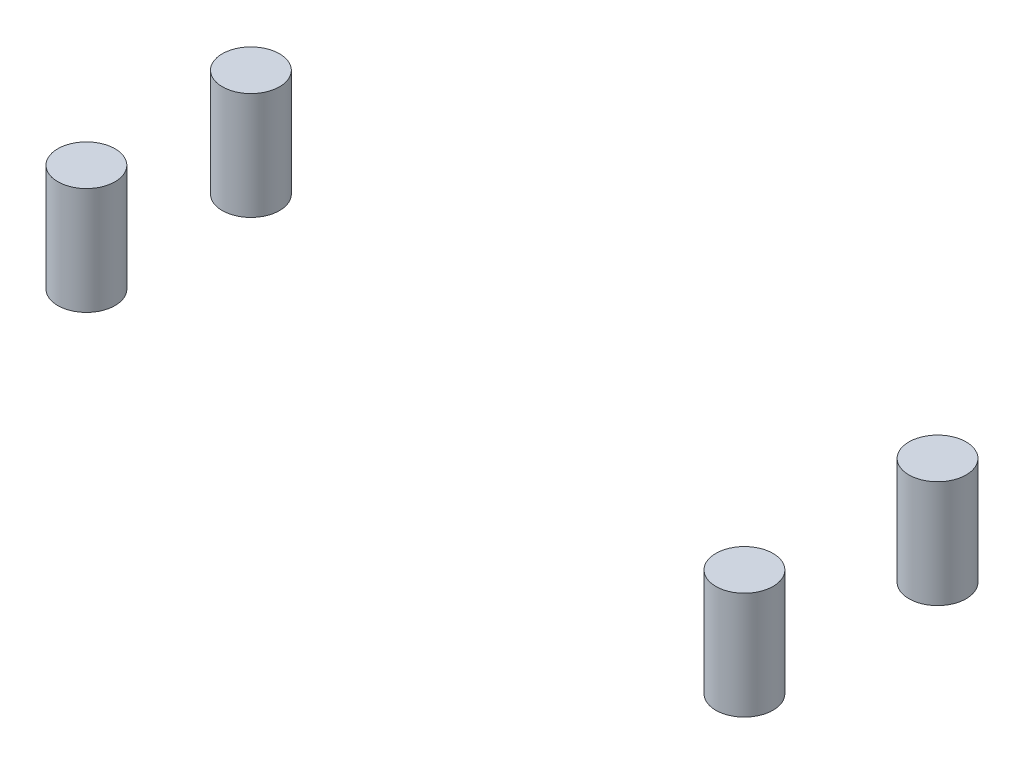
ISO-10303-21;
HEADER;
FILE_DESCRIPTION(('STEP AP214'),'2;1');
FILE_NAME('part.step','',(''),(''),'','','');
FILE_SCHEMA(('AUTOMOTIVE_DESIGN { 1 0 10303 214 1 1 1 1 }'));
ENDSEC;
DATA;
#1=APPLICATION_CONTEXT('core data for automotive mechanical design processes');
#2=APPLICATION_PROTOCOL_DEFINITION('international standard','automotive_design',2000,#1);
#3=PRODUCT_CONTEXT('',#1,'mechanical');
#4=PRODUCT('Part','Part','',(#3));
#5=PRODUCT_RELATED_PRODUCT_CATEGORY('part','',(#4));
#6=PRODUCT_DEFINITION_FORMATION('','',#4);
#7=PRODUCT_DEFINITION_CONTEXT('part definition',#1,'design');
#8=PRODUCT_DEFINITION('design','',#6,#7);
#9=PRODUCT_DEFINITION_SHAPE('','',#8);
#10=(LENGTH_UNIT() NAMED_UNIT(*) SI_UNIT(.MILLI.,.METRE.));
#11=(NAMED_UNIT(*) PLANE_ANGLE_UNIT() SI_UNIT($,.RADIAN.));
#12=(NAMED_UNIT(*) SI_UNIT($,.STERADIAN.) SOLID_ANGLE_UNIT());
#13=UNCERTAINTY_MEASURE_WITH_UNIT(LENGTH_MEASURE(1.E-05),#10,'distance_accuracy_value','');
#14=(GEOMETRIC_REPRESENTATION_CONTEXT(3) GLOBAL_UNCERTAINTY_ASSIGNED_CONTEXT((#13)) GLOBAL_UNIT_ASSIGNED_CONTEXT((#10,
#11,#12)) REPRESENTATION_CONTEXT('',''));
#15=CARTESIAN_POINT('',(0.,0.,0.));
#16=DIRECTION('',(0.,0.,1.));
#17=DIRECTION('',(1.,0.,0.));
#18=AXIS2_PLACEMENT_3D('',#15,#16,#17);
#19=CARTESIAN_POINT('',(51.300000026676,15.,-12.9600000067392));
#20=DIRECTION('',(0.,-1.,0.));
#21=DIRECTION('',(0.,0.,-1.));
#22=AXIS2_PLACEMENT_3D('',#19,#20,#21);
#23=CYLINDRICAL_SURFACE('',#22,4.);
#24=CARTESIAN_POINT('',(51.300000026676,15.,-12.9600000067392));
#25=DIRECTION('',(0.,1.,0.));
#26=DIRECTION('',(0.,0.,1.));
#27=AXIS2_PLACEMENT_3D('',#24,#25,#26);
#28=CIRCLE('',#27,4.);
#29=CARTESIAN_POINT('',(51.300000026676,15.,-8.9600000067392));
#30=VERTEX_POINT('',#29);
#31=EDGE_CURVE('E11',#30,#30,#28,.T.);
#32=ORIENTED_EDGE('',*,*,#31,.F.);
#33=EDGE_LOOP('',(#32));
#34=FACE_BOUND('',#33,.T.);
#35=CARTESIAN_POINT('',(51.300000026676,0.,-12.9600000067392));
#36=DIRECTION('',(0.,1.,0.));
#37=DIRECTION('',(0.,0.,1.));
#38=AXIS2_PLACEMENT_3D('',#35,#36,#37);
#39=CIRCLE('',#38,4.);
#40=CARTESIAN_POINT('',(51.300000026676,0.,-8.9600000067392));
#41=VERTEX_POINT('',#40);
#42=EDGE_CURVE('E43',#41,#41,#39,.T.);
#43=ORIENTED_EDGE('',*,*,#42,.T.);
#44=EDGE_LOOP('',(#43));
#45=FACE_BOUND('',#44,.T.);
#46=ADVANCED_FACE('F40',(#34,#45),#23,.T.);
#47=CARTESIAN_POINT('',(51.300000026676,15.,-12.9600000067392));
#48=DIRECTION('',(0.,1.,0.));
#49=DIRECTION('',(0.,0.,1.));
#50=AXIS2_PLACEMENT_3D('',#47,#48,#49);
#51=PLANE('',#50);
#52=ORIENTED_EDGE('',*,*,#31,.T.);
#53=EDGE_LOOP('',(#52));
#54=FACE_BOUND('',#53,.T.);
#55=ADVANCED_FACE('F55',(#54),#51,.T.);
#56=CARTESIAN_POINT('',(51.300000026676,0.,-12.9600000067392));
#57=DIRECTION('',(0.,1.,0.));
#58=DIRECTION('',(0.,0.,1.));
#59=AXIS2_PLACEMENT_3D('',#56,#57,#58);
#60=PLANE('',#59);
#61=ORIENTED_EDGE('',*,*,#42,.F.);
#62=EDGE_LOOP('',(#61));
#63=FACE_BOUND('',#62,.T.);
#64=ADVANCED_FACE('F53',(#63),#60,.F.);
#65=CLOSED_SHELL('',(#46,#55,#64));
#66=MANIFOLD_SOLID_BREP('B2',#65);
#67=CARTESIAN_POINT('',(51.300000026676,15.,14.0399999932608));
#68=DIRECTION('',(0.,-1.,0.));
#69=DIRECTION('',(0.,0.,-1.));
#70=AXIS2_PLACEMENT_3D('',#67,#68,#69);
#71=CYLINDRICAL_SURFACE('',#70,4.);
#72=CARTESIAN_POINT('',(51.300000026676,15.,14.0399999932608));
#73=DIRECTION('',(0.,1.,0.));
#74=DIRECTION('',(0.,0.,1.));
#75=AXIS2_PLACEMENT_3D('',#72,#73,#74);
#76=CIRCLE('',#75,4.);
#77=CARTESIAN_POINT('',(51.300000026676,15.,18.0399999932608));
#78=VERTEX_POINT('',#77);
#79=EDGE_CURVE('E39',#78,#78,#76,.T.);
#80=ORIENTED_EDGE('',*,*,#79,.F.);
#81=EDGE_LOOP('',(#80));
#82=FACE_BOUND('',#81,.T.);
#83=CARTESIAN_POINT('',(51.300000026676,0.,14.0399999932608));
#84=DIRECTION('',(0.,1.,0.));
#85=DIRECTION('',(0.,0.,1.));
#86=AXIS2_PLACEMENT_3D('',#83,#84,#85);
#87=CIRCLE('',#86,4.);
#88=CARTESIAN_POINT('',(51.300000026676,0.,18.0399999932608));
#89=VERTEX_POINT('',#88);
#90=EDGE_CURVE('E92',#89,#89,#87,.T.);
#91=ORIENTED_EDGE('',*,*,#90,.T.);
#92=EDGE_LOOP('',(#91));
#93=FACE_BOUND('',#92,.T.);
#94=ADVANCED_FACE('F89',(#82,#93),#71,.T.);
#95=CARTESIAN_POINT('',(51.300000026676,15.,14.0399999932608));
#96=DIRECTION('',(0.,1.,0.));
#97=DIRECTION('',(0.,0.,1.));
#98=AXIS2_PLACEMENT_3D('',#95,#96,#97);
#99=PLANE('',#98);
#100=ORIENTED_EDGE('',*,*,#79,.T.);
#101=EDGE_LOOP('',(#100));
#102=FACE_BOUND('',#101,.T.);
#103=ADVANCED_FACE('F104',(#102),#99,.T.);
#104=CARTESIAN_POINT('',(51.300000026676,0.,14.0399999932608));
#105=DIRECTION('',(0.,1.,0.));
#106=DIRECTION('',(0.,0.,1.));
#107=AXIS2_PLACEMENT_3D('',#104,#105,#106);
#108=PLANE('',#107);
#109=ORIENTED_EDGE('',*,*,#90,.F.);
#110=EDGE_LOOP('',(#109));
#111=FACE_BOUND('',#110,.T.);
#112=ADVANCED_FACE('F102',(#111),#108,.F.);
#113=CLOSED_SHELL('',(#94,#103,#112));
#114=MANIFOLD_SOLID_BREP('B6',#113);
#115=CARTESIAN_POINT('',(-43.699999973324,15.,11.0399999932608));
#116=DIRECTION('',(0.,-1.,0.));
#117=DIRECTION('',(0.,0.,-1.));
#118=AXIS2_PLACEMENT_3D('',#115,#116,#117);
#119=CYLINDRICAL_SURFACE('',#118,4.00000000000001);
#120=CARTESIAN_POINT('',(-43.699999973324,15.,11.0399999932608));
#121=DIRECTION('',(0.,1.,0.));
#122=DIRECTION('',(0.,0.,1.));
#123=AXIS2_PLACEMENT_3D('',#120,#121,#122);
#124=CIRCLE('',#123,4.00000000000001);
#125=CARTESIAN_POINT('',(-43.699999973324,15.,15.0399999932608));
#126=VERTEX_POINT('',#125);
#127=EDGE_CURVE('E88',#126,#126,#124,.T.);
#128=ORIENTED_EDGE('',*,*,#127,.F.);
#129=EDGE_LOOP('',(#128));
#130=FACE_BOUND('',#129,.T.);
#131=CARTESIAN_POINT('',(-43.699999973324,0.,11.0399999932608));
#132=DIRECTION('',(0.,1.,0.));
#133=DIRECTION('',(0.,0.,1.));
#134=AXIS2_PLACEMENT_3D('',#131,#132,#133);
#135=CIRCLE('',#134,4.00000000000001);
#136=CARTESIAN_POINT('',(-43.699999973324,0.,15.0399999932608));
#137=VERTEX_POINT('',#136);
#138=EDGE_CURVE('E140',#137,#137,#135,.T.);
#139=ORIENTED_EDGE('',*,*,#138,.T.);
#140=EDGE_LOOP('',(#139));
#141=FACE_BOUND('',#140,.T.);
#142=ADVANCED_FACE('F137',(#130,#141),#119,.T.);
#143=CARTESIAN_POINT('',(-43.699999973324,15.,11.0399999932608));
#144=DIRECTION('',(0.,1.,0.));
#145=DIRECTION('',(0.,0.,1.));
#146=AXIS2_PLACEMENT_3D('',#143,#144,#145);
#147=PLANE('',#146);
#148=ORIENTED_EDGE('',*,*,#127,.T.);
#149=EDGE_LOOP('',(#148));
#150=FACE_BOUND('',#149,.T.);
#151=ADVANCED_FACE('F152',(#150),#147,.T.);
#152=CARTESIAN_POINT('',(-43.699999973324,0.,11.0399999932608));
#153=DIRECTION('',(0.,1.,0.));
#154=DIRECTION('',(0.,0.,1.));
#155=AXIS2_PLACEMENT_3D('',#152,#153,#154);
#156=PLANE('',#155);
#157=ORIENTED_EDGE('',*,*,#138,.F.);
#158=EDGE_LOOP('',(#157));
#159=FACE_BOUND('',#158,.T.);
#160=ADVANCED_FACE('F150',(#159),#156,.F.);
#161=CLOSED_SHELL('',(#142,#151,#160));
#162=MANIFOLD_SOLID_BREP('B34',#161);
#163=CARTESIAN_POINT('',(-43.699999973324,15.,-11.9599999807392));
#164=DIRECTION('',(0.,-1.,0.));
#165=DIRECTION('',(0.,0.,-1.));
#166=AXIS2_PLACEMENT_3D('',#163,#164,#165);
#167=CYLINDRICAL_SURFACE('',#166,4.00000000000001);
#168=CARTESIAN_POINT('',(-43.699999973324,15.,-11.9599999807392));
#169=DIRECTION('',(0.,1.,0.));
#170=DIRECTION('',(0.,0.,1.));
#171=AXIS2_PLACEMENT_3D('',#168,#169,#170);
#172=CIRCLE('',#171,4.00000000000001);
#173=CARTESIAN_POINT('',(-43.699999973324,15.,-7.95999998073919));
#174=VERTEX_POINT('',#173);
#175=EDGE_CURVE('E136',#174,#174,#172,.T.);
#176=ORIENTED_EDGE('',*,*,#175,.F.);
#177=EDGE_LOOP('',(#176));
#178=FACE_BOUND('',#177,.T.);
#179=CARTESIAN_POINT('',(-43.699999973324,0.,-11.9599999807392));
#180=DIRECTION('',(0.,1.,0.));
#181=DIRECTION('',(0.,0.,1.));
#182=AXIS2_PLACEMENT_3D('',#179,#180,#181);
#183=CIRCLE('',#182,4.00000000000001);
#184=CARTESIAN_POINT('',(-43.699999973324,0.,-7.95999998073919));
#185=VERTEX_POINT('',#184);
#186=EDGE_CURVE('E181',#185,#185,#183,.T.);
#187=ORIENTED_EDGE('',*,*,#186,.T.);
#188=EDGE_LOOP('',(#187));
#189=FACE_BOUND('',#188,.T.);
#190=ADVANCED_FACE('F178',(#178,#189),#167,.T.);
#191=CARTESIAN_POINT('',(-43.699999973324,15.,-11.9599999807392));
#192=DIRECTION('',(0.,1.,0.));
#193=DIRECTION('',(0.,0.,1.));
#194=AXIS2_PLACEMENT_3D('',#191,#192,#193);
#195=PLANE('',#194);
#196=ORIENTED_EDGE('',*,*,#175,.T.);
#197=EDGE_LOOP('',(#196));
#198=FACE_BOUND('',#197,.T.);
#199=ADVANCED_FACE('F193',(#198),#195,.T.);
#200=CARTESIAN_POINT('',(-43.699999973324,0.,-11.9599999807392));
#201=DIRECTION('',(0.,1.,0.));
#202=DIRECTION('',(0.,0.,1.));
#203=AXIS2_PLACEMENT_3D('',#200,#201,#202);
#204=PLANE('',#203);
#205=ORIENTED_EDGE('',*,*,#186,.F.);
#206=EDGE_LOOP('',(#205));
#207=FACE_BOUND('',#206,.T.);
#208=ADVANCED_FACE('F191',(#207),#204,.F.);
#209=CLOSED_SHELL('',(#190,#199,#208));
#210=MANIFOLD_SOLID_BREP('B83',#209);
#211=ADVANCED_BREP_SHAPE_REPRESENTATION('',(#18,#66,#114,#162,#210),#14);
#212=SHAPE_DEFINITION_REPRESENTATION(#9,#211);
ENDSEC;
END-ISO-10303-21;
